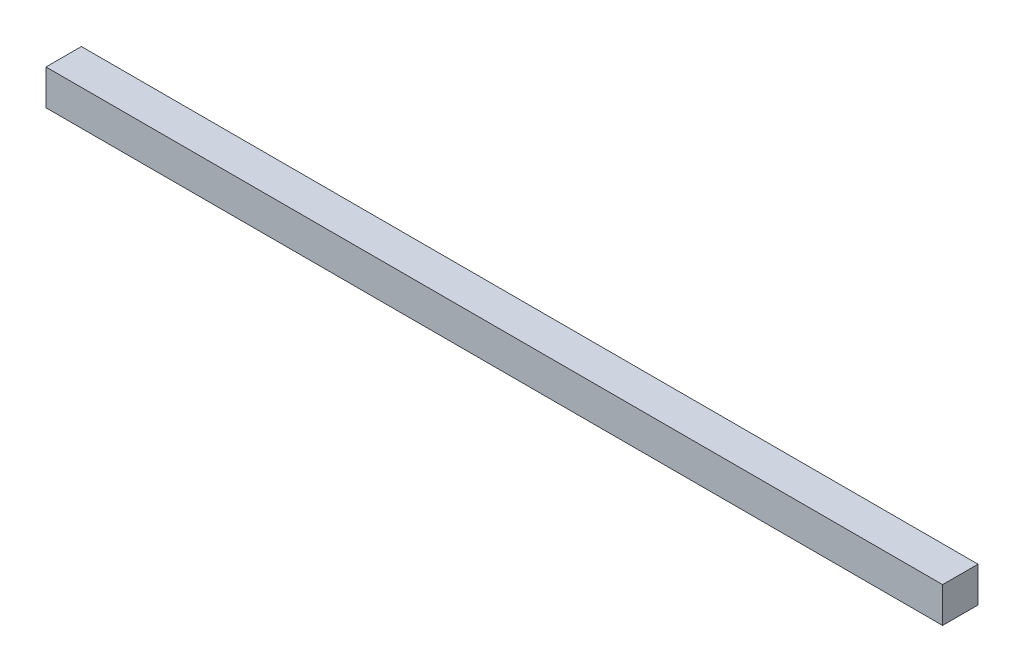
ISO-10303-21;
HEADER;
FILE_DESCRIPTION(('STEP AP214'),'2;1');
FILE_NAME('part.step','',(''),(''),'','','');
FILE_SCHEMA(('AUTOMOTIVE_DESIGN { 1 0 10303 214 1 1 1 1 }'));
ENDSEC;
DATA;
#1=APPLICATION_CONTEXT('core data for automotive mechanical design processes');
#2=APPLICATION_PROTOCOL_DEFINITION('international standard','automotive_design',2000,#1);
#3=PRODUCT_CONTEXT('',#1,'mechanical');
#4=PRODUCT('Part','Part','',(#3));
#5=PRODUCT_RELATED_PRODUCT_CATEGORY('part','',(#4));
#6=PRODUCT_DEFINITION_FORMATION('','',#4);
#7=PRODUCT_DEFINITION_CONTEXT('part definition',#1,'design');
#8=PRODUCT_DEFINITION('design','',#6,#7);
#9=PRODUCT_DEFINITION_SHAPE('','',#8);
#10=(LENGTH_UNIT() NAMED_UNIT(*) SI_UNIT(.MILLI.,.METRE.));
#11=(NAMED_UNIT(*) PLANE_ANGLE_UNIT() SI_UNIT($,.RADIAN.));
#12=(NAMED_UNIT(*) SI_UNIT($,.STERADIAN.) SOLID_ANGLE_UNIT());
#13=UNCERTAINTY_MEASURE_WITH_UNIT(LENGTH_MEASURE(1.E-05),#10,'distance_accuracy_value','');
#14=(GEOMETRIC_REPRESENTATION_CONTEXT(3) GLOBAL_UNCERTAINTY_ASSIGNED_CONTEXT((#13)) GLOBAL_UNIT_ASSIGNED_CONTEXT((#10,
#11,#12)) REPRESENTATION_CONTEXT('',''));
#15=CARTESIAN_POINT('',(0.,0.,0.));
#16=DIRECTION('',(0.,0.,1.));
#17=DIRECTION('',(1.,0.,0.));
#18=AXIS2_PLACEMENT_3D('',#15,#16,#17);
#19=CARTESIAN_POINT('',(-38.,1.5,1.5));
#20=DIRECTION('',(1.,0.,0.));
#21=DIRECTION('',(0.,0.,-1.));
#22=AXIS2_PLACEMENT_3D('',#19,#20,#21);
#23=PLANE('',#22);
#24=DIRECTION('',(0.,0.,1.));
#25=VECTOR('',#24,1.);
#26=CARTESIAN_POINT('',(-38.,-1.5,1.5));
#27=LINE('',#26,#25);
#28=CARTESIAN_POINT('',(-38.,-1.5,-1.5));
#29=VERTEX_POINT('',#28);
#30=CARTESIAN_POINT('',(-38.,-1.5,1.5));
#31=VERTEX_POINT('',#30);
#32=EDGE_CURVE('E100',#29,#31,#27,.T.);
#33=ORIENTED_EDGE('',*,*,#32,.T.);
#34=DIRECTION('',(0.,-1.,0.));
#35=VECTOR('',#34,1.);
#36=CARTESIAN_POINT('',(-38.,1.5,1.5));
#37=LINE('',#36,#35);
#38=CARTESIAN_POINT('',(-38.,1.5,1.5));
#39=VERTEX_POINT('',#38);
#40=EDGE_CURVE('E11',#39,#31,#37,.T.);
#41=ORIENTED_EDGE('',*,*,#40,.F.);
#42=DIRECTION('',(0.,0.,1.));
#43=VECTOR('',#42,1.);
#44=CARTESIAN_POINT('',(-38.,1.5,1.5));
#45=LINE('',#44,#43);
#46=CARTESIAN_POINT('',(-38.,1.5,-1.5));
#47=VERTEX_POINT('',#46);
#48=EDGE_CURVE('E88',#47,#39,#45,.T.);
#49=ORIENTED_EDGE('',*,*,#48,.F.);
#50=DIRECTION('',(0.,-1.,0.));
#51=VECTOR('',#50,1.);
#52=CARTESIAN_POINT('',(-38.,1.5,-1.5));
#53=LINE('',#52,#51);
#54=EDGE_CURVE('E96',#47,#29,#53,.T.);
#55=ORIENTED_EDGE('',*,*,#54,.T.);
#56=EDGE_LOOP('',(#33,#41,#49,#55));
#57=FACE_BOUND('',#56,.T.);
#58=ADVANCED_FACE('F37',(#57),#23,.F.);
#59=CARTESIAN_POINT('',(38.,1.5,1.5));
#60=DIRECTION('',(0.,0.,-1.));
#61=DIRECTION('',(-1.,0.,0.));
#62=AXIS2_PLACEMENT_3D('',#59,#60,#61);
#63=PLANE('',#62);
#64=DIRECTION('',(1.,0.,0.));
#65=VECTOR('',#64,1.);
#66=CARTESIAN_POINT('',(38.,-1.5,1.5));
#67=LINE('',#66,#65);
#68=CARTESIAN_POINT('',(38.,-1.5,1.5));
#69=VERTEX_POINT('',#68);
#70=EDGE_CURVE('E92',#31,#69,#67,.T.);
#71=ORIENTED_EDGE('',*,*,#70,.T.);
#72=DIRECTION('',(0.,-1.,0.));
#73=VECTOR('',#72,1.);
#74=CARTESIAN_POINT('',(38.,1.5,1.5));
#75=LINE('',#74,#73);
#76=CARTESIAN_POINT('',(38.,1.5,1.5));
#77=VERTEX_POINT('',#76);
#78=EDGE_CURVE('E45',#77,#69,#75,.T.);
#79=ORIENTED_EDGE('',*,*,#78,.F.);
#80=DIRECTION('',(1.,0.,0.));
#81=VECTOR('',#80,1.);
#82=CARTESIAN_POINT('',(38.,1.5,1.5));
#83=LINE('',#82,#81);
#84=EDGE_CURVE('E83',#39,#77,#83,.T.);
#85=ORIENTED_EDGE('',*,*,#84,.F.);
#86=ORIENTED_EDGE('',*,*,#40,.T.);
#87=EDGE_LOOP('',(#71,#79,#85,#86));
#88=FACE_BOUND('',#87,.T.);
#89=ADVANCED_FACE('F91',(#88),#63,.F.);
#90=CARTESIAN_POINT('',(38.,1.5,1.5));
#91=DIRECTION('',(-1.,0.,0.));
#92=DIRECTION('',(0.,0.,1.));
#93=AXIS2_PLACEMENT_3D('',#90,#91,#92);
#94=PLANE('',#93);
#95=DIRECTION('',(0.,0.,-1.));
#96=VECTOR('',#95,1.);
#97=CARTESIAN_POINT('',(38.,-1.5,1.5));
#98=LINE('',#97,#96);
#99=CARTESIAN_POINT('',(38.,-1.5,-1.5));
#100=VERTEX_POINT('',#99);
#101=EDGE_CURVE('E70',#69,#100,#98,.T.);
#102=ORIENTED_EDGE('',*,*,#101,.T.);
#103=DIRECTION('',(0.,-1.,0.));
#104=VECTOR('',#103,1.);
#105=CARTESIAN_POINT('',(38.,1.5,-1.5));
#106=LINE('',#105,#104);
#107=CARTESIAN_POINT('',(38.,1.5,-1.5));
#108=VERTEX_POINT('',#107);
#109=EDGE_CURVE('E93',#108,#100,#106,.T.);
#110=ORIENTED_EDGE('',*,*,#109,.F.);
#111=DIRECTION('',(0.,0.,-1.));
#112=VECTOR('',#111,1.);
#113=CARTESIAN_POINT('',(38.,1.5,1.5));
#114=LINE('',#113,#112);
#115=EDGE_CURVE('E86',#77,#108,#114,.T.);
#116=ORIENTED_EDGE('',*,*,#115,.F.);
#117=ORIENTED_EDGE('',*,*,#78,.T.);
#118=EDGE_LOOP('',(#102,#110,#116,#117));
#119=FACE_BOUND('',#118,.T.);
#120=ADVANCED_FACE('F94',(#119),#94,.F.);
#121=CARTESIAN_POINT('',(38.,1.5,-1.5));
#122=DIRECTION('',(0.,0.,1.));
#123=DIRECTION('',(1.,0.,0.));
#124=AXIS2_PLACEMENT_3D('',#121,#122,#123);
#125=PLANE('',#124);
#126=DIRECTION('',(-1.,0.,0.));
#127=VECTOR('',#126,1.);
#128=CARTESIAN_POINT('',(38.,-1.5,-1.5));
#129=LINE('',#128,#127);
#130=EDGE_CURVE('E76',#100,#29,#129,.T.);
#131=ORIENTED_EDGE('',*,*,#130,.T.);
#132=ORIENTED_EDGE('',*,*,#54,.F.);
#133=DIRECTION('',(-1.,0.,0.));
#134=VECTOR('',#133,1.);
#135=CARTESIAN_POINT('',(38.,1.5,-1.5));
#136=LINE('',#135,#134);
#137=EDGE_CURVE('E53',#108,#47,#136,.T.);
#138=ORIENTED_EDGE('',*,*,#137,.F.);
#139=ORIENTED_EDGE('',*,*,#109,.T.);
#140=EDGE_LOOP('',(#131,#132,#138,#139));
#141=FACE_BOUND('',#140,.T.);
#142=ADVANCED_FACE('F107',(#141),#125,.F.);
#143=CARTESIAN_POINT('',(0.,1.5,0.));
#144=DIRECTION('',(0.,1.,0.));
#145=DIRECTION('',(0.,0.,1.));
#146=AXIS2_PLACEMENT_3D('',#143,#144,#145);
#147=PLANE('',#146);
#148=ORIENTED_EDGE('',*,*,#48,.T.);
#149=ORIENTED_EDGE('',*,*,#84,.T.);
#150=ORIENTED_EDGE('',*,*,#115,.T.);
#151=ORIENTED_EDGE('',*,*,#137,.T.);
#152=EDGE_LOOP('',(#148,#149,#150,#151));
#153=FACE_BOUND('',#152,.T.);
#154=ADVANCED_FACE('F84',(#153),#147,.T.);
#155=CARTESIAN_POINT('',(0.,-1.5,0.));
#156=DIRECTION('',(0.,1.,0.));
#157=DIRECTION('',(0.,0.,1.));
#158=AXIS2_PLACEMENT_3D('',#155,#156,#157);
#159=PLANE('',#158);
#160=ORIENTED_EDGE('',*,*,#32,.F.);
#161=ORIENTED_EDGE('',*,*,#130,.F.);
#162=ORIENTED_EDGE('',*,*,#101,.F.);
#163=ORIENTED_EDGE('',*,*,#70,.F.);
#164=EDGE_LOOP('',(#160,#161,#162,#163));
#165=FACE_BOUND('',#164,.T.);
#166=ADVANCED_FACE('F110',(#165),#159,.F.);
#167=CLOSED_SHELL('',(#58,#89,#120,#142,#154,#166));
#168=MANIFOLD_SOLID_BREP('B2',#167);
#169=ADVANCED_BREP_SHAPE_REPRESENTATION('',(#18,#168),#14);
#170=SHAPE_DEFINITION_REPRESENTATION(#9,#169);
ENDSEC;
END-ISO-10303-21;
